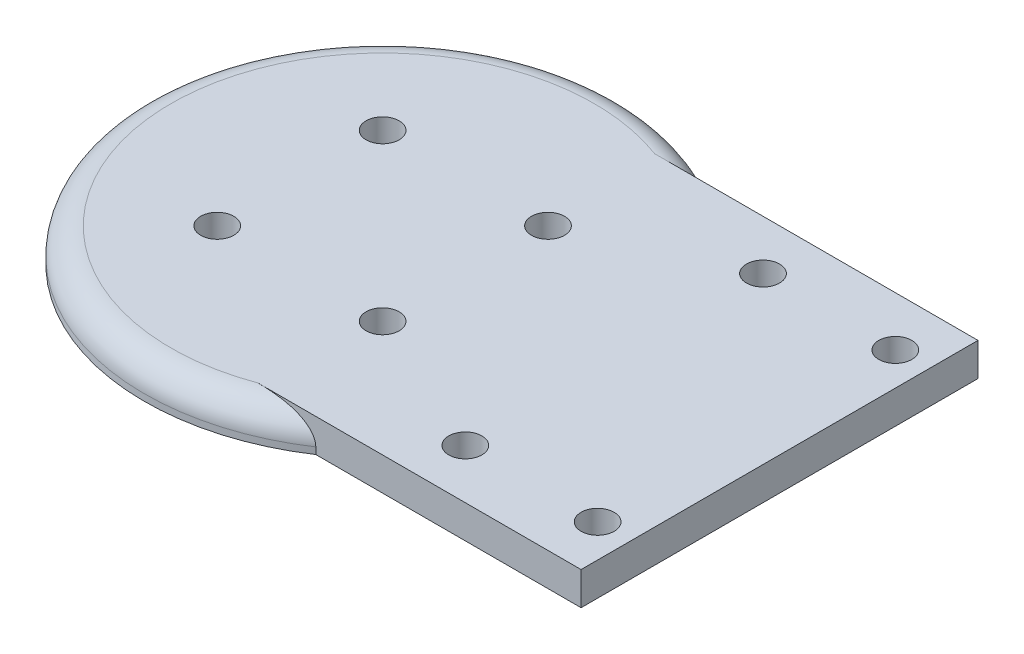
ISO-10303-21;
HEADER;
FILE_DESCRIPTION(('STEP AP214'),'2;1');
FILE_NAME('part.step','',(''),(''),'','','');
FILE_SCHEMA(('AUTOMOTIVE_DESIGN { 1 0 10303 214 1 1 1 1 }'));
ENDSEC;
DATA;
#1=APPLICATION_CONTEXT('core data for automotive mechanical design processes');
#2=APPLICATION_PROTOCOL_DEFINITION('international standard','automotive_design',2000,#1);
#3=PRODUCT_CONTEXT('',#1,'mechanical');
#4=PRODUCT('Part','Part','',(#3));
#5=PRODUCT_RELATED_PRODUCT_CATEGORY('part','',(#4));
#6=PRODUCT_DEFINITION_FORMATION('','',#4);
#7=PRODUCT_DEFINITION_CONTEXT('part definition',#1,'design');
#8=PRODUCT_DEFINITION('design','',#6,#7);
#9=PRODUCT_DEFINITION_SHAPE('','',#8);
#10=(LENGTH_UNIT() NAMED_UNIT(*) SI_UNIT(.MILLI.,.METRE.));
#11=(NAMED_UNIT(*) PLANE_ANGLE_UNIT() SI_UNIT($,.RADIAN.));
#12=(NAMED_UNIT(*) SI_UNIT($,.STERADIAN.) SOLID_ANGLE_UNIT());
#13=UNCERTAINTY_MEASURE_WITH_UNIT(LENGTH_MEASURE(1.E-05),#10,'distance_accuracy_value','');
#14=(GEOMETRIC_REPRESENTATION_CONTEXT(3) GLOBAL_UNCERTAINTY_ASSIGNED_CONTEXT((#13)) GLOBAL_UNIT_ASSIGNED_CONTEXT((#10,
#11,#12)) REPRESENTATION_CONTEXT('',''));
#15=CARTESIAN_POINT('',(0.,0.,0.));
#16=DIRECTION('',(0.,0.,1.));
#17=DIRECTION('',(1.,0.,0.));
#18=AXIS2_PLACEMENT_3D('',#15,#16,#17);
#19=CARTESIAN_POINT('',(0.,5.,0.));
#20=DIRECTION('',(0.,-1.,0.));
#21=DIRECTION('',(0.,0.,-1.));
#22=AXIS2_PLACEMENT_3D('',#19,#20,#21);
#23=CYLINDRICAL_SURFACE('',#22,36.);
#24=DIRECTION('',(0.,-1.,0.));
#25=VECTOR('',#24,1.);
#26=CARTESIAN_POINT('',(19.8997487421324,5.,30.));
#27=LINE('',#26,#25);
#28=CARTESIAN_POINT('',(19.8997487421324,1.,30.));
#29=VERTEX_POINT('',#28);
#30=CARTESIAN_POINT('',(19.8997487421324,0.,30.));
#31=VERTEX_POINT('',#30);
#32=EDGE_CURVE('E102',#29,#31,#27,.T.);
#33=ORIENTED_EDGE('',*,*,#32,.F.);
#34=CARTESIAN_POINT('',(0.,1.,0.));
#35=DIRECTION('',(0.,1.,0.));
#36=DIRECTION('',(0.,0.,1.));
#37=AXIS2_PLACEMENT_3D('',#34,#35,#36);
#38=CIRCLE('',#37,36.);
#39=CARTESIAN_POINT('',(19.8997487421324,1.,-30.));
#40=VERTEX_POINT('',#39);
#41=EDGE_CURVE('E55',#29,#40,#38,.F.);
#42=ORIENTED_EDGE('',*,*,#41,.T.);
#43=DIRECTION('',(0.,-1.,0.));
#44=VECTOR('',#43,1.);
#45=CARTESIAN_POINT('',(19.8997487421324,5.,-30.));
#46=LINE('',#45,#44);
#47=CARTESIAN_POINT('',(19.8997487421324,0.,-30.));
#48=VERTEX_POINT('',#47);
#49=EDGE_CURVE('E110',#40,#48,#46,.T.);
#50=ORIENTED_EDGE('',*,*,#49,.T.);
#51=CARTESIAN_POINT('',(0.,0.,0.));
#52=DIRECTION('',(0.,1.,0.));
#53=DIRECTION('',(0.,0.,1.));
#54=AXIS2_PLACEMENT_3D('',#51,#52,#53);
#55=CIRCLE('',#54,36.);
#56=EDGE_CURVE('E114',#48,#31,#55,.T.);
#57=ORIENTED_EDGE('',*,*,#56,.T.);
#58=EDGE_LOOP('',(#33,#42,#50,#57));
#59=FACE_BOUND('',#58,.T.);
#60=ADVANCED_FACE('F35',(#59),#23,.T.);
#61=CARTESIAN_POINT('',(19.8997487421324,5.,30.));
#62=DIRECTION('',(0.,0.,-1.));
#63=DIRECTION('',(-1.,0.,0.));
#64=AXIS2_PLACEMENT_3D('',#61,#62,#63);
#65=PLANE('',#64);
#66=DIRECTION('',(1.,0.,0.));
#67=VECTOR('',#66,1.);
#68=CARTESIAN_POINT('',(19.8997487421324,0.,30.));
#69=LINE('',#68,#67);
#70=CARTESIAN_POINT('',(60.,0.,30.));
#71=VERTEX_POINT('',#70);
#72=EDGE_CURVE('E99',#31,#71,#69,.T.);
#73=ORIENTED_EDGE('',*,*,#72,.T.);
#74=DIRECTION('',(0.,-1.,0.));
#75=VECTOR('',#74,1.);
#76=CARTESIAN_POINT('',(60.,5.,30.));
#77=LINE('',#76,#75);
#78=CARTESIAN_POINT('',(60.,5.,30.));
#79=VERTEX_POINT('',#78);
#80=EDGE_CURVE('E96',#79,#71,#77,.T.);
#81=ORIENTED_EDGE('',*,*,#80,.F.);
#82=DIRECTION('',(1.,0.,0.));
#83=VECTOR('',#82,1.);
#84=CARTESIAN_POINT('',(19.8997487421324,5.,30.));
#85=LINE('',#84,#83);
#86=CARTESIAN_POINT('',(11.13552872566,5.,30.));
#87=VERTEX_POINT('',#86);
#88=EDGE_CURVE('E85',#87,#79,#85,.T.);
#89=ORIENTED_EDGE('',*,*,#88,.F.);
#90=CARTESIAN_POINT('',(11.13552872566,5.,30.));
#91=CARTESIAN_POINT('',(11.3254173995269,4.99999383854429,30.));
#92=CARTESIAN_POINT('',(11.5153143701635,4.99836222543872,30.));
#93=CARTESIAN_POINT('',(11.8950735193495,4.99136300785284,30.));
#94=CARTESIAN_POINT('',(12.0849356846735,4.98599470202112,30.));
#95=CARTESIAN_POINT('',(12.4651403531544,4.97101151145724,30.));
#96=CARTESIAN_POINT('',(12.6554823258998,4.96138241417745,30.));
#97=CARTESIAN_POINT('',(13.0358415888424,4.93732663944926,30.));
#98=CARTESIAN_POINT('',(13.2258588971136,4.9229002384357,30.));
#99=CARTESIAN_POINT('',(13.7983857032899,4.87126955604774,30.));
#100=CARTESIAN_POINT('',(14.1802453595501,4.82581723388419,30.));
#101=CARTESIAN_POINT('',(14.7495183659967,4.73694366857628,30.));
#102=CARTESIAN_POINT('',(14.9385777513444,4.70389594724885,30.));
#103=CARTESIAN_POINT('',(15.3151595562524,4.63001434025068,30.));
#104=CARTESIAN_POINT('',(15.5026822579023,4.58918191860054,30.));
#105=CARTESIAN_POINT('',(15.8256559078004,4.51084448203758,30.));
#106=CARTESIAN_POINT('',(15.9616020450829,4.47537717808055,30.));
#107=CARTESIAN_POINT('',(16.2320602156985,4.39927615775197,30.));
#108=CARTESIAN_POINT('',(16.3665721478466,4.35864207943767,30.));
#109=CARTESIAN_POINT('',(16.6337366201248,4.27171579166375,30.));
#110=CARTESIAN_POINT('',(16.7663895006605,4.22542463355284,30.));
#111=CARTESIAN_POINT('',(17.0293624637226,4.12661444091849,30.));
#112=CARTESIAN_POINT('',(17.1596826294203,4.07409562894874,30.));
#113=CARTESIAN_POINT('',(17.4184053014281,3.96173977550612,30.));
#114=CARTESIAN_POINT('',(17.5467836791785,3.90184682958776,30.));
#115=CARTESIAN_POINT('',(17.799657130072,3.77437075512734,30.));
#116=CARTESIAN_POINT('',(17.9241529512037,3.70678911964699,30.));
#117=CARTESIAN_POINT('',(18.168033159157,3.56320919697337,30.));
#118=CARTESIAN_POINT('',(18.2874234927356,3.4872210933724,30.));
#119=CARTESIAN_POINT('',(18.5197065360653,3.32596342321135,30.));
#120=CARTESIAN_POINT('',(18.632602671088,3.24069881931447,30.));
#121=CARTESIAN_POINT('',(18.8737285259974,3.04032062121727,30.));
#122=CARTESIAN_POINT('',(18.9999508116535,2.92274880553425,30.));
#123=CARTESIAN_POINT('',(19.2351891711463,2.67132203390005,30.));
#124=CARTESIAN_POINT('',(19.3442160389233,2.53747738696697,30.));
#125=CARTESIAN_POINT('',(19.5243006653979,2.27438078882469,30.));
#126=CARTESIAN_POINT('',(19.5985868065435,2.14736310012541,30.));
#127=CARTESIAN_POINT('',(19.7250969742529,1.88293741284562,30.));
#128=CARTESIAN_POINT('',(19.7773802770951,1.74555852197753,30.));
#129=CARTESIAN_POINT('',(19.8437272402206,1.506425492257,30.));
#130=CARTESIAN_POINT('',(19.8645789179483,1.40654534436469,30.));
#131=CARTESIAN_POINT('',(19.8855979293374,1.25512215390684,30.));
#132=CARTESIAN_POINT('',(19.8908947930749,1.20426046618753,30.));
#133=CARTESIAN_POINT('',(19.8979739148268,1.1022704639101,30.));
#134=CARTESIAN_POINT('',(19.8997545858459,1.05114203939648,30.));
#135=CARTESIAN_POINT('',(19.8997487421324,1.,30.));
#136=B_SPLINE_CURVE_WITH_KNOTS('',3,(#90,#91,#92,#93,#94,#95,#96,#97,#98,#99,#100,#101,#102,
#103,#104,#105,#106,#107,#108,#109,#110,#111,#112,#113,#114,#115,#116,#117,#118,#119,#120,#121,
#122,#123,#124,#125,#126,#127,#128,#129,#130,#131,#132,#133,#134,#135),.UNSPECIFIED.,.F.,.F.,(4,
2,2,2,2,2,2,2,2,2,2,2,2,2,2,2,2,2,2,2,2,2,4),(0.,0.569670558815465,1.13944806970344,
1.71114066208385,2.28280031755299,3.43548871097005,4.0111436363873,4.5866904085324,
5.00809277412729,5.42952467607001,5.85087837512176,6.2722170210613,6.69697323666216,
7.12164710946086,7.5458120521658,7.96975118424715,8.48591961776913,9.00176274029385,
9.44152303063216,9.88009089015899,10.1852617522287,10.3385616753186,10.4919307728583),.UNSPECIFIED.);
#137=EDGE_CURVE('E48',#87,#29,#136,.T.);
#138=ORIENTED_EDGE('',*,*,#137,.T.);
#139=ORIENTED_EDGE('',*,*,#32,.T.);
#140=EDGE_LOOP('',(#73,#81,#89,#138,#139));
#141=FACE_BOUND('',#140,.T.);
#142=ADVANCED_FACE('F97',(#141),#65,.F.);
#143=CARTESIAN_POINT('',(60.,5.,30.));
#144=DIRECTION('',(-1.,0.,0.));
#145=DIRECTION('',(0.,0.,1.));
#146=AXIS2_PLACEMENT_3D('',#143,#144,#145);
#147=PLANE('',#146);
#148=DIRECTION('',(0.,0.,-1.));
#149=VECTOR('',#148,1.);
#150=CARTESIAN_POINT('',(60.,0.,30.));
#151=LINE('',#150,#149);
#152=CARTESIAN_POINT('',(60.,0.,-30.));
#153=VERTEX_POINT('',#152);
#154=EDGE_CURVE('E119',#71,#153,#151,.T.);
#155=ORIENTED_EDGE('',*,*,#154,.T.);
#156=DIRECTION('',(0.,-1.,0.));
#157=VECTOR('',#156,1.);
#158=CARTESIAN_POINT('',(60.,5.,-30.));
#159=LINE('',#158,#157);
#160=CARTESIAN_POINT('',(60.,5.,-30.));
#161=VERTEX_POINT('',#160);
#162=EDGE_CURVE('E103',#161,#153,#159,.T.);
#163=ORIENTED_EDGE('',*,*,#162,.F.);
#164=DIRECTION('',(0.,0.,-1.));
#165=VECTOR('',#164,1.);
#166=CARTESIAN_POINT('',(60.,5.,30.));
#167=LINE('',#166,#165);
#168=EDGE_CURVE('E89',#79,#161,#167,.T.);
#169=ORIENTED_EDGE('',*,*,#168,.F.);
#170=ORIENTED_EDGE('',*,*,#80,.T.);
#171=EDGE_LOOP('',(#155,#163,#169,#170));
#172=FACE_BOUND('',#171,.T.);
#173=ADVANCED_FACE('F105',(#172),#147,.F.);
#174=CARTESIAN_POINT('',(60.,5.,-30.));
#175=DIRECTION('',(0.,0.,1.));
#176=DIRECTION('',(1.,0.,0.));
#177=AXIS2_PLACEMENT_3D('',#174,#175,#176);
#178=PLANE('',#177);
#179=DIRECTION('',(-1.,0.,0.));
#180=VECTOR('',#179,1.);
#181=CARTESIAN_POINT('',(60.,0.,-30.));
#182=LINE('',#181,#180);
#183=EDGE_CURVE('E93',#153,#48,#182,.T.);
#184=ORIENTED_EDGE('',*,*,#183,.T.);
#185=ORIENTED_EDGE('',*,*,#49,.F.);
#186=CARTESIAN_POINT('',(19.8997487421324,1.,-30.));
#187=CARTESIAN_POINT('',(19.8997909302809,1.07778919544949,-30.));
#188=CARTESIAN_POINT('',(19.8956452928912,1.15555299257604,-30.));
#189=CARTESIAN_POINT('',(19.8793066171475,1.3101280993839,-30.));
#190=CARTESIAN_POINT('',(19.8671244768334,1.38694055563901,-30.));
#191=CARTESIAN_POINT('',(19.835240656358,1.53797293732608,-30.));
#192=CARTESIAN_POINT('',(19.8156352130178,1.61221329643629,-30.));
#193=CARTESIAN_POINT('',(19.7694477039348,1.75848203960806,-30.));
#194=CARTESIAN_POINT('',(19.742863811299,1.83050983891848,-30.));
#195=CARTESIAN_POINT('',(19.6538952506646,2.04174567102769,-30.));
#196=CARTESIAN_POINT('',(19.5820797163723,2.1770605440386,-30.));
#197=CARTESIAN_POINT('',(19.4184803054372,2.43525732700096,-30.));
#198=CARTESIAN_POINT('',(19.3266282915222,2.5580946631216,-30.));
#199=CARTESIAN_POINT('',(19.0734910231856,2.85442185888176,-30.));
#200=CARTESIAN_POINT('',(18.9016815098386,3.01893812046112,-30.));
#201=CARTESIAN_POINT('',(18.6270173426797,3.24423145495789,-30.));
#202=CARTESIAN_POINT('',(18.5325134324848,3.31582235759678,-30.));
#203=CARTESIAN_POINT('',(18.3388474905281,3.45241657540667,-30.));
#204=CARTESIAN_POINT('',(18.2396863891188,3.51742119817504,-30.));
#205=CARTESIAN_POINT('',(17.9633751598292,3.686882611202,-30.));
#206=CARTESIAN_POINT('',(17.7824739007783,3.78521838283397,-30.));
#207=CARTESIAN_POINT('',(17.4128781567986,3.96603113773097,-30.));
#208=CARTESIAN_POINT('',(17.224177570041,4.04849540725957,-30.));
#209=CARTESIAN_POINT('',(16.8401867027877,4.20009189432779,-30.));
#210=CARTESIAN_POINT('',(16.6448626760051,4.26913779655467,-30.));
#211=CARTESIAN_POINT('',(16.250453071912,4.39506043624602,-30.));
#212=CARTESIAN_POINT('',(16.0513688650349,4.45194151758554,-30.));
#213=CARTESIAN_POINT('',(15.6562130914692,4.55363866034617,-30.));
#214=CARTESIAN_POINT('',(15.4602172552221,4.59875225091035,-30.));
#215=CARTESIAN_POINT('',(15.06638711165,4.6801876656979,-30.));
#216=CARTESIAN_POINT('',(14.8685524678858,4.71650784678457,-30.));
#217=CARTESIAN_POINT('',(14.471336233505,4.78142746654989,-30.));
#218=CARTESIAN_POINT('',(14.2719527999431,4.81001550614363,-30.));
#219=CARTESIAN_POINT('',(13.8723170124659,4.86030617837565,-30.));
#220=CARTESIAN_POINT('',(13.6720646060658,4.88200838908148,-30.));
#221=CARTESIAN_POINT('',(13.2770819180795,4.91875580506079,-30.));
#222=CARTESIAN_POINT('',(13.0823683042455,4.93398290473175,-30.));
#223=CARTESIAN_POINT('',(12.6926041391757,4.95935833119457,-30.));
#224=CARTESIAN_POINT('',(12.497553569475,4.96950637018926,-30.));
#225=CARTESIAN_POINT('',(12.1080236281153,4.98528174533824,-30.));
#226=CARTESIAN_POINT('',(11.9135449293106,4.99092624386851,-30.));
#227=CARTESIAN_POINT('',(11.5245499844647,4.99828143836093,-30.));
#228=CARTESIAN_POINT('',(11.3300337535249,4.99999291446174,-30.));
#229=CARTESIAN_POINT('',(11.13552872566,5.,-30.));
#230=B_SPLINE_CURVE_WITH_KNOTS('',3,(#186,#187,#188,#189,#190,#191,#192,#193,#194,#195,#196,
#197,#198,#199,#200,#201,#202,#203,#204,#205,#206,#207,#208,#209,#210,#211,#212,#213,#214,#215,
#216,#217,#218,#219,#220,#221,#222,#223,#224,#225,#226,#227,#228,#229),.UNSPECIFIED.,.F.,.F.,(4,
2,2,2,2,2,2,2,2,2,2,2,2,2,2,2,2,2,2,2,2,4),(0.,0.233216314850733,0.466117020963115,
0.696096374495871,0.926135994627784,1.38332528117442,1.84209424858221,2.55140656687279,
2.90692101031556,3.2623647333473,3.87906744464754,4.4962621230899,5.1173043291982,
5.73812439879936,6.34125969897027,6.94450761418395,7.54864007725918,8.15280955169465,
8.73866005483006,9.32454375052582,9.90818391456451,10.4917083000698),.UNSPECIFIED.);
#231=CARTESIAN_POINT('',(11.13552872566,5.,-30.));
#232=VERTEX_POINT('',#231);
#233=EDGE_CURVE('E11',#40,#232,#230,.T.);
#234=ORIENTED_EDGE('',*,*,#233,.T.);
#235=DIRECTION('',(-1.,0.,0.));
#236=VECTOR('',#235,1.);
#237=CARTESIAN_POINT('',(60.,5.,-30.));
#238=LINE('',#237,#236);
#239=EDGE_CURVE('E108',#161,#232,#238,.T.);
#240=ORIENTED_EDGE('',*,*,#239,.F.);
#241=ORIENTED_EDGE('',*,*,#162,.T.);
#242=EDGE_LOOP('',(#184,#185,#234,#240,#241));
#243=FACE_BOUND('',#242,.T.);
#244=ADVANCED_FACE('F141',(#243),#178,.F.);
#245=CARTESIAN_POINT('',(0.,5.,0.));
#246=DIRECTION('',(0.,1.,0.));
#247=DIRECTION('',(0.,0.,1.));
#248=AXIS2_PLACEMENT_3D('',#245,#246,#247);
#249=PLANE('',#248);
#250=CARTESIAN_POINT('',(35.,5.,-22.5));
#251=DIRECTION('',(0.,1.,0.));
#252=DIRECTION('',(0.,0.,1.));
#253=AXIS2_PLACEMENT_3D('',#250,#251,#252);
#254=CIRCLE('',#253,2.5);
#255=CARTESIAN_POINT('',(35.,5.,-20.));
#256=VERTEX_POINT('',#255);
#257=EDGE_CURVE('E278',#256,#256,#254,.T.);
#258=ORIENTED_EDGE('',*,*,#257,.F.);
#259=EDGE_LOOP('',(#258));
#260=FACE_BOUND('',#259,.T.);
#261=CARTESIAN_POINT('',(12.5000000000003,5.,12.4999999999989));
#262=DIRECTION('',(0.,1.,0.));
#263=DIRECTION('',(0.,0.,1.));
#264=AXIS2_PLACEMENT_3D('',#261,#262,#263);
#265=CIRCLE('',#264,2.50000000000075);
#266=CARTESIAN_POINT('',(12.5000000000003,5.,14.9999999999997));
#267=VERTEX_POINT('',#266);
#268=EDGE_CURVE('E282',#267,#267,#265,.T.);
#269=ORIENTED_EDGE('',*,*,#268,.F.);
#270=EDGE_LOOP('',(#269));
#271=FACE_BOUND('',#270,.T.);
#272=CARTESIAN_POINT('',(12.4999999999996,5.,-12.5000000000007));
#273=DIRECTION('',(0.,1.,0.));
#274=DIRECTION('',(0.,0.,1.));
#275=AXIS2_PLACEMENT_3D('',#272,#273,#274);
#276=CIRCLE('',#275,2.50000000000084);
#277=CARTESIAN_POINT('',(12.4999999999996,5.,-9.99999999999987));
#278=VERTEX_POINT('',#277);
#279=EDGE_CURVE('E295',#278,#278,#276,.T.);
#280=ORIENTED_EDGE('',*,*,#279,.F.);
#281=EDGE_LOOP('',(#280));
#282=FACE_BOUND('',#281,.T.);
#283=CARTESIAN_POINT('',(-12.4999999999993,5.,12.4999999999996));
#284=DIRECTION('',(0.,1.,0.));
#285=DIRECTION('',(0.,0.,1.));
#286=AXIS2_PLACEMENT_3D('',#283,#284,#285);
#287=CIRCLE('',#286,2.50000000000002);
#288=CARTESIAN_POINT('',(-12.4999999999993,5.,14.9999999999997));
#289=VERTEX_POINT('',#288);
#290=EDGE_CURVE('E288',#289,#289,#287,.T.);
#291=ORIENTED_EDGE('',*,*,#290,.F.);
#292=EDGE_LOOP('',(#291));
#293=FACE_BOUND('',#292,.T.);
#294=CARTESIAN_POINT('',(35.0000000000005,5.,22.5));
#295=DIRECTION('',(0.,1.,0.));
#296=DIRECTION('',(0.,0.,1.));
#297=AXIS2_PLACEMENT_3D('',#294,#295,#296);
#298=CIRCLE('',#297,2.5);
#299=CARTESIAN_POINT('',(35.0000000000005,5.,25.));
#300=VERTEX_POINT('',#299);
#301=EDGE_CURVE('E284',#300,#300,#298,.T.);
#302=ORIENTED_EDGE('',*,*,#301,.F.);
#303=EDGE_LOOP('',(#302));
#304=FACE_BOUND('',#303,.T.);
#305=CARTESIAN_POINT('',(55.0000000000005,5.,22.5));
#306=DIRECTION('',(0.,1.,0.));
#307=DIRECTION('',(0.,0.,1.));
#308=AXIS2_PLACEMENT_3D('',#305,#306,#307);
#309=CIRCLE('',#308,2.5);
#310=CARTESIAN_POINT('',(55.0000000000005,5.,25.));
#311=VERTEX_POINT('',#310);
#312=EDGE_CURVE('E323',#311,#311,#309,.T.);
#313=ORIENTED_EDGE('',*,*,#312,.F.);
#314=EDGE_LOOP('',(#313));
#315=FACE_BOUND('',#314,.T.);
#316=CARTESIAN_POINT('',(55.,5.,-22.5));
#317=DIRECTION('',(0.,1.,0.));
#318=DIRECTION('',(0.,0.,1.));
#319=AXIS2_PLACEMENT_3D('',#316,#317,#318);
#320=CIRCLE('',#319,2.5);
#321=CARTESIAN_POINT('',(55.,5.,-20.));
#322=VERTEX_POINT('',#321);
#323=EDGE_CURVE('E317',#322,#322,#320,.T.);
#324=ORIENTED_EDGE('',*,*,#323,.F.);
#325=EDGE_LOOP('',(#324));
#326=FACE_BOUND('',#325,.T.);
#327=CARTESIAN_POINT('',(-12.5,5.,-12.5));
#328=DIRECTION('',(0.,1.,0.));
#329=DIRECTION('',(0.,0.,1.));
#330=AXIS2_PLACEMENT_3D('',#327,#328,#329);
#331=CIRCLE('',#330,2.5);
#332=CARTESIAN_POINT('',(-12.5,5.,-9.99999999999999));
#333=VERTEX_POINT('',#332);
#334=EDGE_CURVE('E291',#333,#333,#331,.T.);
#335=ORIENTED_EDGE('',*,*,#334,.F.);
#336=EDGE_LOOP('',(#335));
#337=FACE_BOUND('',#336,.T.);
#338=CARTESIAN_POINT('',(0.,5.,0.));
#339=DIRECTION('',(0.,1.,0.));
#340=DIRECTION('',(0.,0.,1.));
#341=AXIS2_PLACEMENT_3D('',#338,#339,#340);
#342=CIRCLE('',#341,32.);
#343=EDGE_CURVE('E92',#232,#87,#342,.T.);
#344=ORIENTED_EDGE('',*,*,#343,.T.);
#345=ORIENTED_EDGE('',*,*,#88,.T.);
#346=ORIENTED_EDGE('',*,*,#168,.T.);
#347=ORIENTED_EDGE('',*,*,#239,.T.);
#348=EDGE_LOOP('',(#344,#345,#346,#347));
#349=FACE_BOUND('',#348,.T.);
#350=ADVANCED_FACE('F87',(#260,#271,#282,#293,#304,#315,#326,#337,#349),#249,.T.);
#351=CARTESIAN_POINT('',(0.,0.,0.));
#352=DIRECTION('',(0.,1.,0.));
#353=DIRECTION('',(0.,0.,1.));
#354=AXIS2_PLACEMENT_3D('',#351,#352,#353);
#355=PLANE('',#354);
#356=CARTESIAN_POINT('',(35.,0.,-22.5));
#357=DIRECTION('',(0.,1.,0.));
#358=DIRECTION('',(0.,0.,1.));
#359=AXIS2_PLACEMENT_3D('',#356,#357,#358);
#360=CIRCLE('',#359,2.5);
#361=CARTESIAN_POINT('',(35.,0.,-20.));
#362=VERTEX_POINT('',#361);
#363=EDGE_CURVE('E275',#362,#362,#360,.T.);
#364=ORIENTED_EDGE('',*,*,#363,.T.);
#365=EDGE_LOOP('',(#364));
#366=FACE_BOUND('',#365,.T.);
#367=CARTESIAN_POINT('',(12.5000000000003,0.,12.4999999999989));
#368=DIRECTION('',(0.,1.,0.));
#369=DIRECTION('',(0.,0.,1.));
#370=AXIS2_PLACEMENT_3D('',#367,#368,#369);
#371=CIRCLE('',#370,2.50000000000075);
#372=CARTESIAN_POINT('',(12.5000000000003,0.,14.9999999999997));
#373=VERTEX_POINT('',#372);
#374=EDGE_CURVE('E279',#373,#373,#371,.T.);
#375=ORIENTED_EDGE('',*,*,#374,.T.);
#376=EDGE_LOOP('',(#375));
#377=FACE_BOUND('',#376,.T.);
#378=CARTESIAN_POINT('',(12.4999999999996,0.,-12.5000000000007));
#379=DIRECTION('',(0.,1.,0.));
#380=DIRECTION('',(0.,0.,1.));
#381=AXIS2_PLACEMENT_3D('',#378,#379,#380);
#382=CIRCLE('',#381,2.50000000000084);
#383=CARTESIAN_POINT('',(12.4999999999996,0.,-9.99999999999987));
#384=VERTEX_POINT('',#383);
#385=EDGE_CURVE('E298',#384,#384,#382,.T.);
#386=ORIENTED_EDGE('',*,*,#385,.T.);
#387=EDGE_LOOP('',(#386));
#388=FACE_BOUND('',#387,.T.);
#389=CARTESIAN_POINT('',(-12.4999999999993,0.,12.4999999999996));
#390=DIRECTION('',(0.,1.,0.));
#391=DIRECTION('',(0.,0.,1.));
#392=AXIS2_PLACEMENT_3D('',#389,#390,#391);
#393=CIRCLE('',#392,2.50000000000002);
#394=CARTESIAN_POINT('',(-12.4999999999993,0.,14.9999999999997));
#395=VERTEX_POINT('',#394);
#396=EDGE_CURVE('E292',#395,#395,#393,.T.);
#397=ORIENTED_EDGE('',*,*,#396,.T.);
#398=EDGE_LOOP('',(#397));
#399=FACE_BOUND('',#398,.T.);
#400=CARTESIAN_POINT('',(35.0000000000005,0.,22.5));
#401=DIRECTION('',(0.,1.,0.));
#402=DIRECTION('',(0.,0.,1.));
#403=AXIS2_PLACEMENT_3D('',#400,#401,#402);
#404=CIRCLE('',#403,2.5);
#405=CARTESIAN_POINT('',(35.0000000000005,0.,25.));
#406=VERTEX_POINT('',#405);
#407=EDGE_CURVE('E326',#406,#406,#404,.T.);
#408=ORIENTED_EDGE('',*,*,#407,.T.);
#409=EDGE_LOOP('',(#408));
#410=FACE_BOUND('',#409,.T.);
#411=CARTESIAN_POINT('',(55.0000000000005,0.,22.5));
#412=DIRECTION('',(0.,1.,0.));
#413=DIRECTION('',(0.,0.,1.));
#414=AXIS2_PLACEMENT_3D('',#411,#412,#413);
#415=CIRCLE('',#414,2.5);
#416=CARTESIAN_POINT('',(55.0000000000005,0.,25.));
#417=VERTEX_POINT('',#416);
#418=EDGE_CURVE('E320',#417,#417,#415,.T.);
#419=ORIENTED_EDGE('',*,*,#418,.T.);
#420=EDGE_LOOP('',(#419));
#421=FACE_BOUND('',#420,.T.);
#422=CARTESIAN_POINT('',(55.,0.,-22.5));
#423=DIRECTION('',(0.,1.,0.));
#424=DIRECTION('',(0.,0.,1.));
#425=AXIS2_PLACEMENT_3D('',#422,#423,#424);
#426=CIRCLE('',#425,2.5);
#427=CARTESIAN_POINT('',(55.,0.,-20.));
#428=VERTEX_POINT('',#427);
#429=EDGE_CURVE('E314',#428,#428,#426,.T.);
#430=ORIENTED_EDGE('',*,*,#429,.T.);
#431=EDGE_LOOP('',(#430));
#432=FACE_BOUND('',#431,.T.);
#433=CARTESIAN_POINT('',(-12.5,0.,-12.5));
#434=DIRECTION('',(0.,1.,0.));
#435=DIRECTION('',(0.,0.,1.));
#436=AXIS2_PLACEMENT_3D('',#433,#434,#435);
#437=CIRCLE('',#436,2.5);
#438=CARTESIAN_POINT('',(-12.5,0.,-9.99999999999999));
#439=VERTEX_POINT('',#438);
#440=EDGE_CURVE('E117',#439,#439,#437,.T.);
#441=ORIENTED_EDGE('',*,*,#440,.T.);
#442=EDGE_LOOP('',(#441));
#443=FACE_BOUND('',#442,.T.);
#444=ORIENTED_EDGE('',*,*,#56,.F.);
#445=ORIENTED_EDGE('',*,*,#183,.F.);
#446=ORIENTED_EDGE('',*,*,#154,.F.);
#447=ORIENTED_EDGE('',*,*,#72,.F.);
#448=EDGE_LOOP('',(#444,#445,#446,#447));
#449=FACE_BOUND('',#448,.T.);
#450=ADVANCED_FACE('F144',(#366,#377,#388,#399,#410,#421,#432,#443,#449),#355,.F.);
#451=CARTESIAN_POINT('',(0.,1.,0.));
#452=DIRECTION('',(0.,1.,0.));
#453=DIRECTION('',(0.,0.,1.));
#454=AXIS2_PLACEMENT_3D('',#451,#452,#453);
#455=TOROIDAL_SURFACE('',#454,32.,4.);
#456=ORIENTED_EDGE('',*,*,#233,.F.);
#457=ORIENTED_EDGE('',*,*,#41,.F.);
#458=ORIENTED_EDGE('',*,*,#137,.F.);
#459=ORIENTED_EDGE('',*,*,#343,.F.);
#460=EDGE_LOOP('',(#456,#457,#458,#459));
#461=FACE_BOUND('',#460,.T.);
#462=ADVANCED_FACE('F37',(#461),#455,.T.);
#463=CARTESIAN_POINT('',(-12.5,0.,-12.5));
#464=DIRECTION('',(0.,1.,0.));
#465=DIRECTION('',(0.,0.,1.));
#466=AXIS2_PLACEMENT_3D('',#463,#464,#465);
#467=CYLINDRICAL_SURFACE('',#466,2.5);
#468=ORIENTED_EDGE('',*,*,#440,.F.);
#469=EDGE_LOOP('',(#468));
#470=FACE_BOUND('',#469,.T.);
#471=ORIENTED_EDGE('',*,*,#334,.T.);
#472=EDGE_LOOP('',(#471));
#473=FACE_BOUND('',#472,.T.);
#474=ADVANCED_FACE('F152',(#470,#473),#467,.F.);
#475=CARTESIAN_POINT('',(55.,0.,-22.5));
#476=DIRECTION('',(0.,1.,0.));
#477=DIRECTION('',(0.,0.,1.));
#478=AXIS2_PLACEMENT_3D('',#475,#476,#477);
#479=CYLINDRICAL_SURFACE('',#478,2.5);
#480=ORIENTED_EDGE('',*,*,#429,.F.);
#481=EDGE_LOOP('',(#480));
#482=FACE_BOUND('',#481,.T.);
#483=ORIENTED_EDGE('',*,*,#323,.T.);
#484=EDGE_LOOP('',(#483));
#485=FACE_BOUND('',#484,.T.);
#486=ADVANCED_FACE('F200',(#482,#485),#479,.F.);
#487=CARTESIAN_POINT('',(55.0000000000005,0.,22.5));
#488=DIRECTION('',(0.,1.,0.));
#489=DIRECTION('',(0.,0.,1.));
#490=AXIS2_PLACEMENT_3D('',#487,#488,#489);
#491=CYLINDRICAL_SURFACE('',#490,2.5);
#492=ORIENTED_EDGE('',*,*,#418,.F.);
#493=EDGE_LOOP('',(#492));
#494=FACE_BOUND('',#493,.T.);
#495=ORIENTED_EDGE('',*,*,#312,.T.);
#496=EDGE_LOOP('',(#495));
#497=FACE_BOUND('',#496,.T.);
#498=ADVANCED_FACE('F209',(#494,#497),#491,.F.);
#499=CARTESIAN_POINT('',(35.0000000000005,0.,22.5));
#500=DIRECTION('',(0.,1.,0.));
#501=DIRECTION('',(0.,0.,1.));
#502=AXIS2_PLACEMENT_3D('',#499,#500,#501);
#503=CYLINDRICAL_SURFACE('',#502,2.5);
#504=ORIENTED_EDGE('',*,*,#407,.F.);
#505=EDGE_LOOP('',(#504));
#506=FACE_BOUND('',#505,.T.);
#507=ORIENTED_EDGE('',*,*,#301,.T.);
#508=EDGE_LOOP('',(#507));
#509=FACE_BOUND('',#508,.T.);
#510=ADVANCED_FACE('F219',(#506,#509),#503,.F.);
#511=CARTESIAN_POINT('',(-12.4999999999993,0.,12.4999999999996));
#512=DIRECTION('',(0.,1.,0.));
#513=DIRECTION('',(0.,0.,1.));
#514=AXIS2_PLACEMENT_3D('',#511,#512,#513);
#515=CYLINDRICAL_SURFACE('',#514,2.50000000000002);
#516=ORIENTED_EDGE('',*,*,#396,.F.);
#517=EDGE_LOOP('',(#516));
#518=FACE_BOUND('',#517,.T.);
#519=ORIENTED_EDGE('',*,*,#290,.T.);
#520=EDGE_LOOP('',(#519));
#521=FACE_BOUND('',#520,.T.);
#522=ADVANCED_FACE('F229',(#518,#521),#515,.F.);
#523=CARTESIAN_POINT('',(12.4999999999996,0.,-12.5000000000007));
#524=DIRECTION('',(0.,1.,0.));
#525=DIRECTION('',(0.,0.,1.));
#526=AXIS2_PLACEMENT_3D('',#523,#524,#525);
#527=CYLINDRICAL_SURFACE('',#526,2.50000000000084);
#528=ORIENTED_EDGE('',*,*,#385,.F.);
#529=EDGE_LOOP('',(#528));
#530=FACE_BOUND('',#529,.T.);
#531=ORIENTED_EDGE('',*,*,#279,.T.);
#532=EDGE_LOOP('',(#531));
#533=FACE_BOUND('',#532,.T.);
#534=ADVANCED_FACE('F239',(#530,#533),#527,.F.);
#535=CARTESIAN_POINT('',(12.5000000000003,0.,12.4999999999989));
#536=DIRECTION('',(0.,1.,0.));
#537=DIRECTION('',(0.,0.,1.));
#538=AXIS2_PLACEMENT_3D('',#535,#536,#537);
#539=CYLINDRICAL_SURFACE('',#538,2.50000000000075);
#540=ORIENTED_EDGE('',*,*,#374,.F.);
#541=EDGE_LOOP('',(#540));
#542=FACE_BOUND('',#541,.T.);
#543=ORIENTED_EDGE('',*,*,#268,.T.);
#544=EDGE_LOOP('',(#543));
#545=FACE_BOUND('',#544,.T.);
#546=ADVANCED_FACE('F249',(#542,#545),#539,.F.);
#547=CARTESIAN_POINT('',(35.,0.,-22.5));
#548=DIRECTION('',(0.,1.,0.));
#549=DIRECTION('',(0.,0.,1.));
#550=AXIS2_PLACEMENT_3D('',#547,#548,#549);
#551=CYLINDRICAL_SURFACE('',#550,2.5);
#552=ORIENTED_EDGE('',*,*,#363,.F.);
#553=EDGE_LOOP('',(#552));
#554=FACE_BOUND('',#553,.T.);
#555=ORIENTED_EDGE('',*,*,#257,.T.);
#556=EDGE_LOOP('',(#555));
#557=FACE_BOUND('',#556,.T.);
#558=ADVANCED_FACE('F259',(#554,#557),#551,.F.);
#559=CLOSED_SHELL('',(#60,#142,#173,#244,#350,#450,#462,#474,#486,#498,#510,#522,#534,#546,#558));
#560=MANIFOLD_SOLID_BREP('B2',#559);
#561=ADVANCED_BREP_SHAPE_REPRESENTATION('',(#18,#560),#14);
#562=SHAPE_DEFINITION_REPRESENTATION(#9,#561);
ENDSEC;
END-ISO-10303-21;
